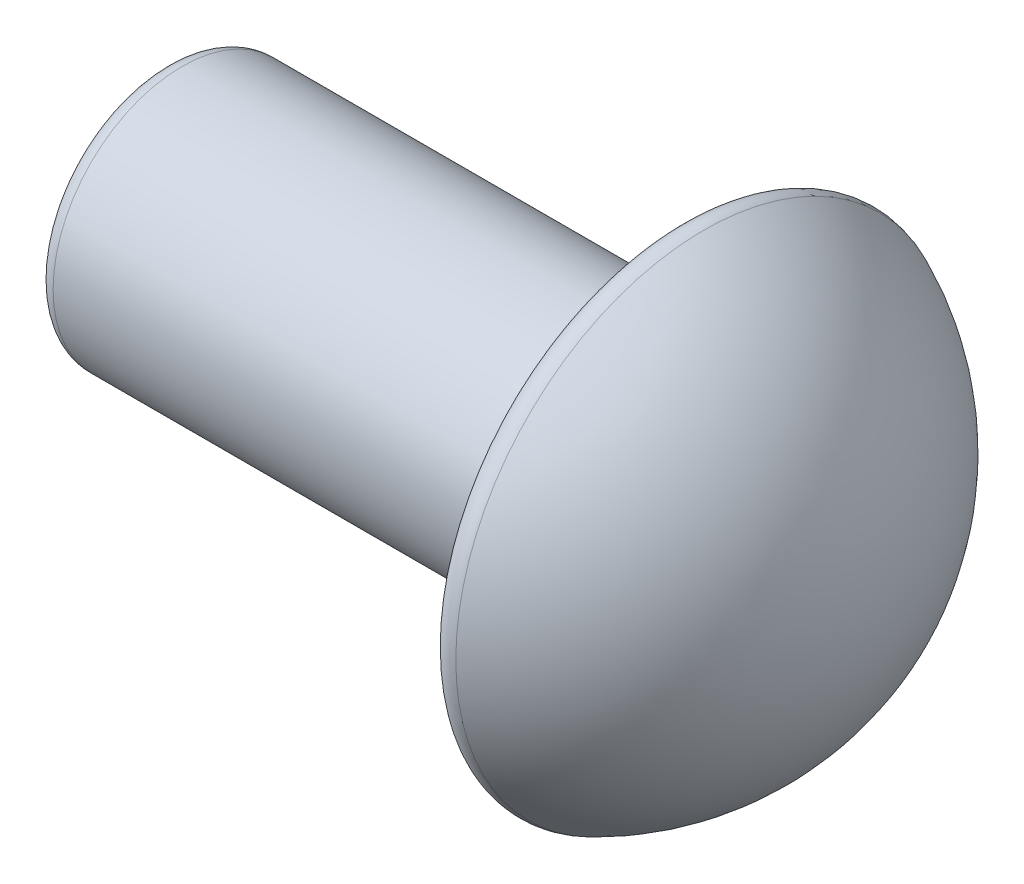
ISO-10303-21;
HEADER;
FILE_DESCRIPTION(('STEP AP214'),'2;1');
FILE_NAME('part.step','',(''),(''),'','','');
FILE_SCHEMA(('AUTOMOTIVE_DESIGN { 1 0 10303 214 1 1 1 1 }'));
ENDSEC;
DATA;
#1=APPLICATION_CONTEXT('core data for automotive mechanical design processes');
#2=APPLICATION_PROTOCOL_DEFINITION('international standard','automotive_design',2000,#1);
#3=PRODUCT_CONTEXT('',#1,'mechanical');
#4=PRODUCT('Part','Part','',(#3));
#5=PRODUCT_RELATED_PRODUCT_CATEGORY('part','',(#4));
#6=PRODUCT_DEFINITION_FORMATION('','',#4);
#7=PRODUCT_DEFINITION_CONTEXT('part definition',#1,'design');
#8=PRODUCT_DEFINITION('design','',#6,#7);
#9=PRODUCT_DEFINITION_SHAPE('','',#8);
#10=(LENGTH_UNIT() NAMED_UNIT(*) SI_UNIT(.MILLI.,.METRE.));
#11=(NAMED_UNIT(*) PLANE_ANGLE_UNIT() SI_UNIT($,.RADIAN.));
#12=(NAMED_UNIT(*) SI_UNIT($,.STERADIAN.) SOLID_ANGLE_UNIT());
#13=UNCERTAINTY_MEASURE_WITH_UNIT(LENGTH_MEASURE(1.E-05),#10,'distance_accuracy_value','');
#14=(GEOMETRIC_REPRESENTATION_CONTEXT(3) GLOBAL_UNCERTAINTY_ASSIGNED_CONTEXT((#13)) GLOBAL_UNIT_ASSIGNED_CONTEXT((#10,
#11,#12)) REPRESENTATION_CONTEXT('',''));
#15=CARTESIAN_POINT('',(0.,0.,0.));
#16=DIRECTION('',(0.,0.,1.));
#17=DIRECTION('',(1.,0.,0.));
#18=AXIS2_PLACEMENT_3D('',#15,#16,#17);
#19=CARTESIAN_POINT('',(5.,0.,0.));
#20=DIRECTION('',(1.,0.,0.));
#21=DIRECTION('',(0.,-1.,0.));
#22=AXIS2_PLACEMENT_3D('',#19,#20,#21);
#23=SPHERICAL_SURFACE('',#22,3.16227766016838);
#24=CARTESIAN_POINT('',(6.28101873879924,0.,0.));
#25=DIRECTION('',(-1.,0.,0.));
#26=DIRECTION('',(0.,0.,1.));
#27=AXIS2_PLACEMENT_3D('',#24,#25,#26);
#28=CIRCLE('',#27,2.89119196713833);
#29=CARTESIAN_POINT('',(6.28101873879924,0.,2.89119196713833));
#30=VERTEX_POINT('',#29);
#31=EDGE_CURVE('E10',#30,#30,#28,.F.);
#32=ORIENTED_EDGE('',*,*,#31,.T.);
#33=EDGE_LOOP('',(#32));
#34=FACE_BOUND('',#33,.T.);
#35=ADVANCED_FACE('F31',(#34),#23,.T.);
#36=CARTESIAN_POINT('',(6.,1.5,0.));
#37=DIRECTION('',(-1.,0.,0.));
#38=DIRECTION('',(0.,0.,1.));
#39=AXIS2_PLACEMENT_3D('',#36,#37,#38);
#40=PLANE('',#39);
#41=CARTESIAN_POINT('',(6.,0.,0.));
#42=DIRECTION('',(-1.,0.,0.));
#43=DIRECTION('',(0.,0.,1.));
#44=AXIS2_PLACEMENT_3D('',#41,#42,#43);
#45=CIRCLE('',#44,1.7);
#46=CARTESIAN_POINT('',(6.,0.,1.7));
#47=VERTEX_POINT('',#46);
#48=EDGE_CURVE('E50',#47,#47,#45,.F.);
#49=ORIENTED_EDGE('',*,*,#48,.T.);
#50=EDGE_LOOP('',(#49));
#51=FACE_BOUND('',#50,.T.);
#52=CARTESIAN_POINT('',(6.,0.,0.));
#53=DIRECTION('',(-1.,0.,0.));
#54=DIRECTION('',(0.,0.,1.));
#55=AXIS2_PLACEMENT_3D('',#52,#53,#54);
#56=CIRCLE('',#55,2.70833693175954);
#57=CARTESIAN_POINT('',(6.,0.,2.70833693175954));
#58=VERTEX_POINT('',#57);
#59=EDGE_CURVE('E53',#58,#58,#56,.T.);
#60=ORIENTED_EDGE('',*,*,#59,.T.);
#61=EDGE_LOOP('',(#60));
#62=FACE_BOUND('',#61,.T.);
#63=ADVANCED_FACE('F57',(#51,#62),#40,.T.);
#64=CARTESIAN_POINT('',(0.,0.,0.));
#65=DIRECTION('',(1.,0.,0.));
#66=DIRECTION('',(0.,0.,-1.));
#67=AXIS2_PLACEMENT_3D('',#64,#65,#66);
#68=CYLINDRICAL_SURFACE('',#67,1.5);
#69=CARTESIAN_POINT('',(5.8,0.,0.));
#70=DIRECTION('',(-1.,0.,0.));
#71=DIRECTION('',(0.,0.,1.));
#72=AXIS2_PLACEMENT_3D('',#69,#70,#71);
#73=CIRCLE('',#72,1.5);
#74=CARTESIAN_POINT('',(5.8,0.,1.5));
#75=VERTEX_POINT('',#74);
#76=EDGE_CURVE('E41',#75,#75,#73,.T.);
#77=ORIENTED_EDGE('',*,*,#76,.T.);
#78=EDGE_LOOP('',(#77));
#79=FACE_BOUND('',#78,.T.);
#80=CARTESIAN_POINT('',(0.2,0.,0.));
#81=DIRECTION('',(-1.,0.,0.));
#82=DIRECTION('',(0.,0.,1.));
#83=AXIS2_PLACEMENT_3D('',#80,#81,#82);
#84=CIRCLE('',#83,1.5);
#85=CARTESIAN_POINT('',(0.2,0.,1.5));
#86=VERTEX_POINT('',#85);
#87=EDGE_CURVE('E45',#86,#86,#84,.F.);
#88=ORIENTED_EDGE('',*,*,#87,.T.);
#89=EDGE_LOOP('',(#88));
#90=FACE_BOUND('',#89,.T.);
#91=ADVANCED_FACE('F74',(#79,#90),#68,.T.);
#92=CARTESIAN_POINT('',(0.,0.,0.));
#93=DIRECTION('',(-1.,0.,0.));
#94=DIRECTION('',(0.,0.,1.));
#95=AXIS2_PLACEMENT_3D('',#92,#93,#94);
#96=PLANE('',#95);
#97=CARTESIAN_POINT('',(0.,0.,0.));
#98=DIRECTION('',(-1.,0.,0.));
#99=DIRECTION('',(0.,0.,1.));
#100=AXIS2_PLACEMENT_3D('',#97,#98,#99);
#101=CIRCLE('',#100,1.3);
#102=CARTESIAN_POINT('',(0.,0.,1.3));
#103=VERTEX_POINT('',#102);
#104=EDGE_CURVE('E37',#103,#103,#101,.T.);
#105=ORIENTED_EDGE('',*,*,#104,.T.);
#106=EDGE_LOOP('',(#105));
#107=FACE_BOUND('',#106,.T.);
#108=ADVANCED_FACE('F79',(#107),#96,.T.);
#109=CARTESIAN_POINT('',(5.8,0.,0.));
#110=DIRECTION('',(-1.,0.,0.));
#111=DIRECTION('',(0.,0.,1.));
#112=AXIS2_PLACEMENT_3D('',#109,#110,#111);
#113=TOROIDAL_SURFACE('',#112,1.7,0.2);
#114=ORIENTED_EDGE('',*,*,#76,.F.);
#115=EDGE_LOOP('',(#114));
#116=FACE_BOUND('',#115,.T.);
#117=ORIENTED_EDGE('',*,*,#48,.F.);
#118=EDGE_LOOP('',(#117));
#119=FACE_BOUND('',#118,.T.);
#120=ADVANCED_FACE('F67',(#116,#119),#113,.F.);
#121=CARTESIAN_POINT('',(0.2,0.,0.));
#122=DIRECTION('',(-1.,0.,0.));
#123=DIRECTION('',(0.,0.,1.));
#124=AXIS2_PLACEMENT_3D('',#121,#122,#123);
#125=TOROIDAL_SURFACE('',#124,1.3,0.2);
#126=ORIENTED_EDGE('',*,*,#104,.F.);
#127=EDGE_LOOP('',(#126));
#128=FACE_BOUND('',#127,.T.);
#129=ORIENTED_EDGE('',*,*,#87,.F.);
#130=EDGE_LOOP('',(#129));
#131=FACE_BOUND('',#130,.T.);
#132=ADVANCED_FACE('F62',(#128,#131),#125,.T.);
#133=CARTESIAN_POINT('',(6.2,0.,0.));
#134=DIRECTION('',(-1.,0.,0.));
#135=DIRECTION('',(0.,0.,1.));
#136=AXIS2_PLACEMENT_3D('',#133,#134,#135);
#137=TOROIDAL_SURFACE('',#136,2.70833693175954,0.2);
#138=ORIENTED_EDGE('',*,*,#59,.F.);
#139=EDGE_LOOP('',(#138));
#140=FACE_BOUND('',#139,.T.);
#141=ORIENTED_EDGE('',*,*,#31,.F.);
#142=EDGE_LOOP('',(#141));
#143=FACE_BOUND('',#142,.T.);
#144=ADVANCED_FACE('F59',(#140,#143),#137,.T.);
#145=CLOSED_SHELL('',(#35,#63,#91,#108,#120,#132,#144));
#146=MANIFOLD_SOLID_BREP('B2',#145);
#147=ADVANCED_BREP_SHAPE_REPRESENTATION('',(#18,#146),#14);
#148=SHAPE_DEFINITION_REPRESENTATION(#9,#147);
ENDSEC;
END-ISO-10303-21;
